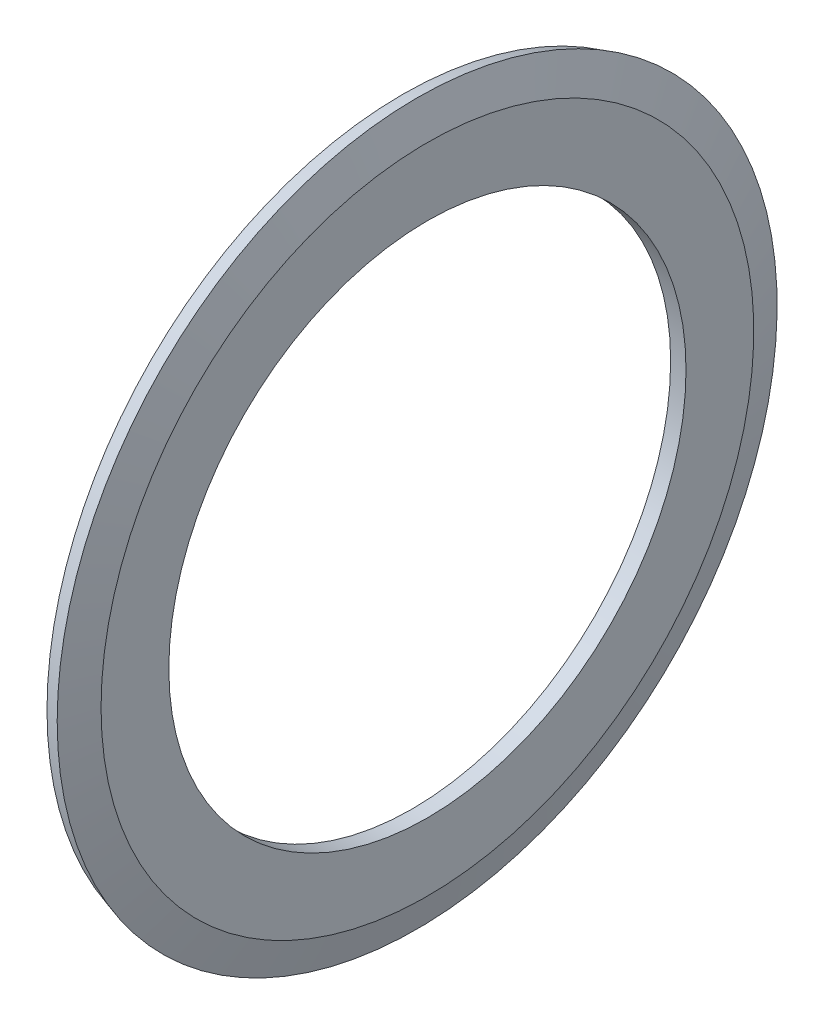
ISO-10303-21;
HEADER;
FILE_DESCRIPTION(('STEP AP214'),'2;1');
FILE_NAME('part.step','',(''),(''),'','','');
FILE_SCHEMA(('AUTOMOTIVE_DESIGN { 1 0 10303 214 1 1 1 1 }'));
ENDSEC;
DATA;
#1=APPLICATION_CONTEXT('core data for automotive mechanical design processes');
#2=APPLICATION_PROTOCOL_DEFINITION('international standard','automotive_design',2000,#1);
#3=PRODUCT_CONTEXT('',#1,'mechanical');
#4=PRODUCT('Part','Part','',(#3));
#5=PRODUCT_RELATED_PRODUCT_CATEGORY('part','',(#4));
#6=PRODUCT_DEFINITION_FORMATION('','',#4);
#7=PRODUCT_DEFINITION_CONTEXT('part definition',#1,'design');
#8=PRODUCT_DEFINITION('design','',#6,#7);
#9=PRODUCT_DEFINITION_SHAPE('','',#8);
#10=(LENGTH_UNIT() NAMED_UNIT(*) SI_UNIT(.MILLI.,.METRE.));
#11=(NAMED_UNIT(*) PLANE_ANGLE_UNIT() SI_UNIT($,.RADIAN.));
#12=(NAMED_UNIT(*) SI_UNIT($,.STERADIAN.) SOLID_ANGLE_UNIT());
#13=UNCERTAINTY_MEASURE_WITH_UNIT(LENGTH_MEASURE(1.E-05),#10,'distance_accuracy_value','');
#14=(GEOMETRIC_REPRESENTATION_CONTEXT(3) GLOBAL_UNCERTAINTY_ASSIGNED_CONTEXT((#13)) GLOBAL_UNIT_ASSIGNED_CONTEXT((#10,
#11,#12)) REPRESENTATION_CONTEXT('',''));
#15=CARTESIAN_POINT('',(0.,0.,0.));
#16=DIRECTION('',(0.,0.,1.));
#17=DIRECTION('',(1.,0.,0.));
#18=AXIS2_PLACEMENT_3D('',#15,#16,#17);
#19=CARTESIAN_POINT('',(-1.65100000000059,0.,0.));
#20=DIRECTION('',(-1.,0.,0.));
#21=DIRECTION('',(0.,0.,1.));
#22=AXIS2_PLACEMENT_3D('',#19,#20,#21);
#23=CONICAL_SURFACE('',#22,23.5154503480018,1.27409035395562);
#24=CARTESIAN_POINT('',(-1.65099999999962,0.,0.));
#25=DIRECTION('',(1.,0.,0.));
#26=DIRECTION('',(0.,-1.,0.));
#27=AXIS2_PLACEMENT_3D('',#24,#25,#26);
#28=CIRCLE('',#27,23.5154503480007);
#29=CARTESIAN_POINT('',(-1.65099999999962,-23.5154503480007,0.));
#30=VERTEX_POINT('',#29);
#31=EDGE_CURVE('E30',#30,#30,#28,.T.);
#32=ORIENTED_EDGE('',*,*,#31,.F.);
#33=EDGE_LOOP('',(#32));
#34=FACE_BOUND('',#33,.T.);
#35=CARTESIAN_POINT('',(-1.01600000000012,0.,0.));
#36=DIRECTION('',(-1.,0.,0.));
#37=DIRECTION('',(0.,0.,1.));
#38=AXIS2_PLACEMENT_3D('',#35,#36,#37);
#39=CIRCLE('',#38,21.4384589352646);
#40=CARTESIAN_POINT('',(-1.01600000000012,0.,21.4384589352646));
#41=VERTEX_POINT('',#40);
#42=EDGE_CURVE('E18',#41,#41,#39,.F.);
#43=ORIENTED_EDGE('',*,*,#42,.T.);
#44=EDGE_LOOP('',(#43));
#45=FACE_BOUND('',#44,.T.);
#46=ADVANCED_FACE('F15',(#34,#45),#23,.F.);
#47=CARTESIAN_POINT('',(-0.679394367941265,0.,0.));
#48=DIRECTION('',(1.,0.,0.));
#49=DIRECTION('',(0.,0.,-1.));
#50=AXIS2_PLACEMENT_3D('',#47,#48,#49);
#51=CONICAL_SURFACE('',#50,23.8124999999989,0.296705972838978);
#52=CARTESIAN_POINT('',(-0.679394367941674,0.,0.));
#53=DIRECTION('',(-1.,0.,0.));
#54=DIRECTION('',(0.,1.,0.));
#55=AXIS2_PLACEMENT_3D('',#52,#53,#54);
#56=CIRCLE('',#55,23.8125);
#57=CARTESIAN_POINT('',(-0.679394367941674,23.8125,0.));
#58=VERTEX_POINT('',#57);
#59=EDGE_CURVE('E33',#58,#58,#56,.F.);
#60=ORIENTED_EDGE('',*,*,#59,.F.);
#61=EDGE_LOOP('',(#60));
#62=FACE_BOUND('',#61,.T.);
#63=ORIENTED_EDGE('',*,*,#31,.T.);
#64=EDGE_LOOP('',(#63));
#65=FACE_BOUND('',#64,.T.);
#66=ADVANCED_FACE('F45',(#62,#65),#51,.T.);
#67=CARTESIAN_POINT('',(-1.016,0.,0.));
#68=DIRECTION('',(1.,0.,0.));
#69=DIRECTION('',(0.,0.,-1.));
#70=AXIS2_PLACEMENT_3D('',#67,#68,#69);
#71=PLANE('',#70);
#72=CARTESIAN_POINT('',(-1.016,0.,0.));
#73=DIRECTION('',(1.,0.,0.));
#74=DIRECTION('',(0.,0.,-1.));
#75=AXIS2_PLACEMENT_3D('',#72,#73,#74);
#76=CIRCLE('',#75,17.1069);
#77=CARTESIAN_POINT('',(-1.016,0.,-17.1069));
#78=VERTEX_POINT('',#77);
#79=EDGE_CURVE('E27',#78,#78,#76,.T.);
#80=ORIENTED_EDGE('',*,*,#79,.T.);
#81=EDGE_LOOP('',(#80));
#82=FACE_BOUND('',#81,.T.);
#83=ORIENTED_EDGE('',*,*,#42,.F.);
#84=EDGE_LOOP('',(#83));
#85=FACE_BOUND('',#84,.T.);
#86=ADVANCED_FACE('F52',(#82,#85),#71,.F.);
#87=CARTESIAN_POINT('',(-0.679394367941674,0.,0.));
#88=DIRECTION('',(-1.,0.,0.));
#89=DIRECTION('',(0.,0.,1.));
#90=AXIS2_PLACEMENT_3D('',#87,#88,#89);
#91=CONICAL_SURFACE('',#90,23.8125,1.27409035395562);
#92=CARTESIAN_POINT('',(0.,0.,0.));
#93=DIRECTION('',(-1.,0.,0.));
#94=DIRECTION('',(0.,0.,1.));
#95=AXIS2_PLACEMENT_3D('',#92,#93,#94);
#96=CIRCLE('',#95,21.5903011526362);
#97=CARTESIAN_POINT('',(0.,0.,21.5903011526362));
#98=VERTEX_POINT('',#97);
#99=EDGE_CURVE('E22',#98,#98,#96,.F.);
#100=ORIENTED_EDGE('',*,*,#99,.F.);
#101=EDGE_LOOP('',(#100));
#102=FACE_BOUND('',#101,.T.);
#103=ORIENTED_EDGE('',*,*,#59,.T.);
#104=EDGE_LOOP('',(#103));
#105=FACE_BOUND('',#104,.T.);
#106=ADVANCED_FACE('F61',(#102,#105),#91,.T.);
#107=CARTESIAN_POINT('',(-1.73355,0.,0.));
#108=DIRECTION('',(1.,0.,0.));
#109=DIRECTION('',(0.,0.,-1.));
#110=AXIS2_PLACEMENT_3D('',#107,#108,#109);
#111=CYLINDRICAL_SURFACE('',#110,17.1069);
#112=CARTESIAN_POINT('',(0.,0.,0.));
#113=DIRECTION('',(1.,0.,0.));
#114=DIRECTION('',(0.,0.,-1.));
#115=AXIS2_PLACEMENT_3D('',#112,#113,#114);
#116=CIRCLE('',#115,17.1069);
#117=CARTESIAN_POINT('',(0.,0.,-17.1069));
#118=VERTEX_POINT('',#117);
#119=EDGE_CURVE('E10',#118,#118,#116,.F.);
#120=ORIENTED_EDGE('',*,*,#119,.F.);
#121=EDGE_LOOP('',(#120));
#122=FACE_BOUND('',#121,.T.);
#123=ORIENTED_EDGE('',*,*,#79,.F.);
#124=EDGE_LOOP('',(#123));
#125=FACE_BOUND('',#124,.T.);
#126=ADVANCED_FACE('F56',(#122,#125),#111,.F.);
#127=CARTESIAN_POINT('',(0.,0.,0.));
#128=DIRECTION('',(1.,0.,0.));
#129=DIRECTION('',(0.,0.,-1.));
#130=AXIS2_PLACEMENT_3D('',#127,#128,#129);
#131=PLANE('',#130);
#132=ORIENTED_EDGE('',*,*,#119,.T.);
#133=EDGE_LOOP('',(#132));
#134=FACE_BOUND('',#133,.T.);
#135=ORIENTED_EDGE('',*,*,#99,.T.);
#136=EDGE_LOOP('',(#135));
#137=FACE_BOUND('',#136,.T.);
#138=ADVANCED_FACE('F54',(#134,#137),#131,.T.);
#139=CLOSED_SHELL('',(#46,#66,#86,#106,#126,#138));
#140=MANIFOLD_SOLID_BREP('B1',#139);
#141=ADVANCED_BREP_SHAPE_REPRESENTATION('',(#18,#140),#14);
#142=SHAPE_DEFINITION_REPRESENTATION(#9,#141);
ENDSEC;
END-ISO-10303-21;
